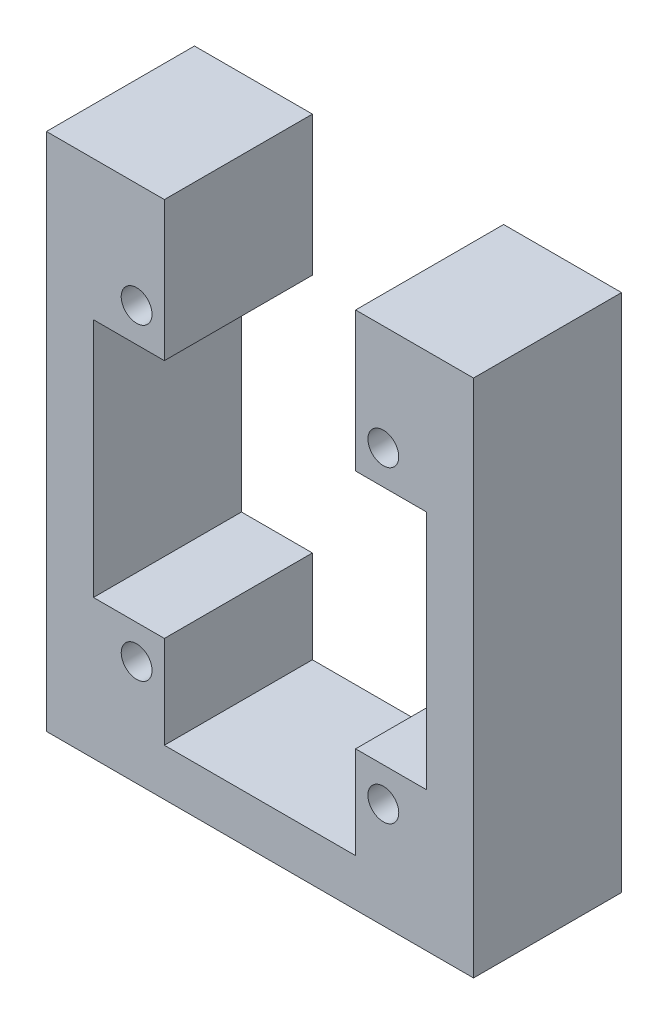
ISO-10303-21;
HEADER;
FILE_DESCRIPTION(('STEP AP214'),'2;1');
FILE_NAME('part.step','',(''),(''),'','','');
FILE_SCHEMA(('AUTOMOTIVE_DESIGN { 1 0 10303 214 1 1 1 1 }'));
ENDSEC;
DATA;
#1=APPLICATION_CONTEXT('core data for automotive mechanical design processes');
#2=APPLICATION_PROTOCOL_DEFINITION('international standard','automotive_design',2000,#1);
#3=PRODUCT_CONTEXT('',#1,'mechanical');
#4=PRODUCT('Part','Part','',(#3));
#5=PRODUCT_RELATED_PRODUCT_CATEGORY('part','',(#4));
#6=PRODUCT_DEFINITION_FORMATION('','',#4);
#7=PRODUCT_DEFINITION_CONTEXT('part definition',#1,'design');
#8=PRODUCT_DEFINITION('design','',#6,#7);
#9=PRODUCT_DEFINITION_SHAPE('','',#8);
#10=(LENGTH_UNIT() NAMED_UNIT(*) SI_UNIT(.MILLI.,.METRE.));
#11=(NAMED_UNIT(*) PLANE_ANGLE_UNIT() SI_UNIT($,.RADIAN.));
#12=(NAMED_UNIT(*) SI_UNIT($,.STERADIAN.) SOLID_ANGLE_UNIT());
#13=UNCERTAINTY_MEASURE_WITH_UNIT(LENGTH_MEASURE(1.E-05),#10,'distance_accuracy_value','');
#14=(GEOMETRIC_REPRESENTATION_CONTEXT(3) GLOBAL_UNCERTAINTY_ASSIGNED_CONTEXT((#13)) GLOBAL_UNIT_ASSIGNED_CONTEXT((#10,
#11,#12)) REPRESENTATION_CONTEXT('',''));
#15=CARTESIAN_POINT('',(0.,0.,0.));
#16=DIRECTION('',(0.,0.,1.));
#17=DIRECTION('',(1.,0.,0.));
#18=AXIS2_PLACEMENT_3D('',#15,#16,#17);
#19=CARTESIAN_POINT('',(-17.31,21.06,12.));
#20=DIRECTION('',(0.,-1.,0.));
#21=DIRECTION('',(0.,0.,-1.));
#22=AXIS2_PLACEMENT_3D('',#19,#20,#21);
#23=PLANE('',#22);
#24=DIRECTION('',(-1.,0.,0.));
#25=VECTOR('',#24,1.);
#26=CARTESIAN_POINT('',(-17.31,21.06,12.));
#27=LINE('',#26,#25);
#28=CARTESIAN_POINT('',(-7.75,21.06,12.));
#29=VERTEX_POINT('',#28);
#30=CARTESIAN_POINT('',(-17.31,21.06,12.));
#31=VERTEX_POINT('',#30);
#32=EDGE_CURVE('E160',#29,#31,#27,.T.);
#33=ORIENTED_EDGE('',*,*,#32,.F.);
#34=DIRECTION('',(0.,0.,-1.));
#35=VECTOR('',#34,1.);
#36=CARTESIAN_POINT('',(-7.75,21.06,12.));
#37=LINE('',#36,#35);
#38=CARTESIAN_POINT('',(-7.75,21.06,0.));
#39=VERTEX_POINT('',#38);
#40=EDGE_CURVE('E167',#29,#39,#37,.T.);
#41=ORIENTED_EDGE('',*,*,#40,.T.);
#42=DIRECTION('',(-1.,0.,0.));
#43=VECTOR('',#42,1.);
#44=CARTESIAN_POINT('',(-17.31,21.06,0.));
#45=LINE('',#44,#43);
#46=CARTESIAN_POINT('',(-17.31,21.06,0.));
#47=VERTEX_POINT('',#46);
#48=EDGE_CURVE('E193',#39,#47,#45,.T.);
#49=ORIENTED_EDGE('',*,*,#48,.T.);
#50=DIRECTION('',(0.,0.,-1.));
#51=VECTOR('',#50,1.);
#52=CARTESIAN_POINT('',(-17.31,21.06,12.));
#53=LINE('',#52,#51);
#54=EDGE_CURVE('E47',#31,#47,#53,.T.);
#55=ORIENTED_EDGE('',*,*,#54,.F.);
#56=EDGE_LOOP('',(#33,#41,#49,#55));
#57=FACE_BOUND('',#56,.T.);
#58=ADVANCED_FACE('F39',(#57),#23,.F.);
#59=CARTESIAN_POINT('',(0.,0.,12.));
#60=DIRECTION('',(0.,0.,-1.));
#61=DIRECTION('',(-1.,0.,0.));
#62=AXIS2_PLACEMENT_3D('',#59,#60,#61);
#63=PLANE('',#62);
#64=DIRECTION('',(0.,-1.,0.));
#65=VECTOR('',#64,1.);
#66=CARTESIAN_POINT('',(-7.75,17.25,12.));
#67=LINE('',#66,#65);
#68=CARTESIAN_POINT('',(-7.75,9.75,12.));
#69=VERTEX_POINT('',#68);
#70=EDGE_CURVE('E155',#29,#69,#67,.T.);
#71=ORIENTED_EDGE('',*,*,#70,.F.);
#72=ORIENTED_EDGE('',*,*,#32,.T.);
#73=DIRECTION('',(0.,-1.,0.));
#74=VECTOR('',#73,1.);
#75=CARTESIAN_POINT('',(-17.31,-21.06,12.));
#76=LINE('',#75,#74);
#77=CARTESIAN_POINT('',(-17.31,-21.06,12.));
#78=VERTEX_POINT('',#77);
#79=EDGE_CURVE('E180',#31,#78,#76,.T.);
#80=ORIENTED_EDGE('',*,*,#79,.T.);
#81=DIRECTION('',(1.,0.,0.));
#82=VECTOR('',#81,1.);
#83=CARTESIAN_POINT('',(-17.31,-21.06,12.));
#84=LINE('',#83,#82);
#85=CARTESIAN_POINT('',(17.31,-21.06,12.));
#86=VERTEX_POINT('',#85);
#87=EDGE_CURVE('E187',#78,#86,#84,.T.);
#88=ORIENTED_EDGE('',*,*,#87,.T.);
#89=DIRECTION('',(0.,1.,0.));
#90=VECTOR('',#89,1.);
#91=CARTESIAN_POINT('',(17.31,-21.06,12.));
#92=LINE('',#91,#90);
#93=CARTESIAN_POINT('',(17.31,21.06,12.));
#94=VERTEX_POINT('',#93);
#95=EDGE_CURVE('E177',#86,#94,#92,.T.);
#96=ORIENTED_EDGE('',*,*,#95,.T.);
#97=CARTESIAN_POINT('',(7.75,21.06,12.));
#98=VERTEX_POINT('',#97);
#99=EDGE_CURVE('E176',#94,#98,#27,.T.);
#100=ORIENTED_EDGE('',*,*,#99,.T.);
#101=DIRECTION('',(0.,1.,0.));
#102=VECTOR('',#101,1.);
#103=CARTESIAN_POINT('',(7.75,17.25,12.));
#104=LINE('',#103,#102);
#105=CARTESIAN_POINT('',(7.75,9.75,12.));
#106=VERTEX_POINT('',#105);
#107=EDGE_CURVE('E222',#106,#98,#104,.T.);
#108=ORIENTED_EDGE('',*,*,#107,.F.);
#109=DIRECTION('',(-1.,0.,0.));
#110=VECTOR('',#109,1.);
#111=CARTESIAN_POINT('',(13.5,9.75,12.));
#112=LINE('',#111,#110);
#113=CARTESIAN_POINT('',(13.5,9.75,12.));
#114=VERTEX_POINT('',#113);
#115=EDGE_CURVE('E297',#114,#106,#112,.T.);
#116=ORIENTED_EDGE('',*,*,#115,.F.);
#117=DIRECTION('',(0.,1.,0.));
#118=VECTOR('',#117,1.);
#119=CARTESIAN_POINT('',(13.5,-17.25,12.));
#120=LINE('',#119,#118);
#121=CARTESIAN_POINT('',(13.5,-9.75,12.));
#122=VERTEX_POINT('',#121);
#123=EDGE_CURVE('E310',#122,#114,#120,.T.);
#124=ORIENTED_EDGE('',*,*,#123,.F.);
#125=DIRECTION('',(1.,0.,0.));
#126=VECTOR('',#125,1.);
#127=CARTESIAN_POINT('',(13.5,-9.75,12.));
#128=LINE('',#127,#126);
#129=CARTESIAN_POINT('',(7.75,-9.75,12.));
#130=VERTEX_POINT('',#129);
#131=EDGE_CURVE('E274',#130,#122,#128,.T.);
#132=ORIENTED_EDGE('',*,*,#131,.F.);
#133=DIRECTION('',(0.,1.,0.));
#134=VECTOR('',#133,1.);
#135=CARTESIAN_POINT('',(7.75,-17.25,12.));
#136=LINE('',#135,#134);
#137=CARTESIAN_POINT('',(7.75,-17.25,12.));
#138=VERTEX_POINT('',#137);
#139=EDGE_CURVE('E280',#138,#130,#136,.T.);
#140=ORIENTED_EDGE('',*,*,#139,.F.);
#141=DIRECTION('',(1.,0.,0.));
#142=VECTOR('',#141,1.);
#143=CARTESIAN_POINT('',(-13.5,-17.25,12.));
#144=LINE('',#143,#142);
#145=CARTESIAN_POINT('',(-7.75,-17.25,12.));
#146=VERTEX_POINT('',#145);
#147=EDGE_CURVE('E194',#146,#138,#144,.T.);
#148=ORIENTED_EDGE('',*,*,#147,.F.);
#149=DIRECTION('',(0.,-1.,0.));
#150=VECTOR('',#149,1.);
#151=CARTESIAN_POINT('',(-7.75,-17.25,12.));
#152=LINE('',#151,#150);
#153=CARTESIAN_POINT('',(-7.75,-9.75,12.));
#154=VERTEX_POINT('',#153);
#155=EDGE_CURVE('E253',#154,#146,#152,.T.);
#156=ORIENTED_EDGE('',*,*,#155,.F.);
#157=DIRECTION('',(1.,0.,0.));
#158=VECTOR('',#157,1.);
#159=CARTESIAN_POINT('',(-13.5,-9.75000000000001,12.));
#160=LINE('',#159,#158);
#161=CARTESIAN_POINT('',(-13.5,-9.75000000000001,12.));
#162=VERTEX_POINT('',#161);
#163=EDGE_CURVE('E261',#162,#154,#160,.T.);
#164=ORIENTED_EDGE('',*,*,#163,.F.);
#165=DIRECTION('',(0.,-1.,0.));
#166=VECTOR('',#165,1.);
#167=CARTESIAN_POINT('',(-13.5,-17.25,12.));
#168=LINE('',#167,#166);
#169=CARTESIAN_POINT('',(-13.5,9.75000000000001,12.));
#170=VERTEX_POINT('',#169);
#171=EDGE_CURVE('E313',#170,#162,#168,.T.);
#172=ORIENTED_EDGE('',*,*,#171,.F.);
#173=DIRECTION('',(-1.,0.,0.));
#174=VECTOR('',#173,1.);
#175=CARTESIAN_POINT('',(-13.5,9.75000000000001,12.));
#176=LINE('',#175,#174);
#177=EDGE_CURVE('E163',#69,#170,#176,.T.);
#178=ORIENTED_EDGE('',*,*,#177,.F.);
#179=EDGE_LOOP('',(#71,#72,#80,#88,#96,#100,#108,#116,#124,#132,#140,#148,#156,#164,#172,#178));
#180=FACE_BOUND('',#179,.T.);
#181=CARTESIAN_POINT('',(-10.,-12.5,12.));
#182=DIRECTION('',(0.,0.,-1.));
#183=DIRECTION('',(-1.,0.,0.));
#184=AXIS2_PLACEMENT_3D('',#181,#182,#183);
#185=CIRCLE('',#184,1.25);
#186=CARTESIAN_POINT('',(-11.25,-12.5,12.));
#187=VERTEX_POINT('',#186);
#188=EDGE_CURVE('E263',#187,#187,#185,.T.);
#189=ORIENTED_EDGE('',*,*,#188,.T.);
#190=EDGE_LOOP('',(#189));
#191=FACE_BOUND('',#190,.T.);
#192=CARTESIAN_POINT('',(10.,-12.5,12.));
#193=DIRECTION('',(0.,0.,-1.));
#194=DIRECTION('',(1.,0.,0.));
#195=AXIS2_PLACEMENT_3D('',#192,#193,#194);
#196=CIRCLE('',#195,1.25);
#197=CARTESIAN_POINT('',(11.25,-12.5,12.));
#198=VERTEX_POINT('',#197);
#199=EDGE_CURVE('E283',#198,#198,#196,.T.);
#200=ORIENTED_EDGE('',*,*,#199,.T.);
#201=EDGE_LOOP('',(#200));
#202=FACE_BOUND('',#201,.T.);
#203=CARTESIAN_POINT('',(-10.,12.5,12.));
#204=DIRECTION('',(0.,0.,-1.));
#205=DIRECTION('',(1.,0.,0.));
#206=AXIS2_PLACEMENT_3D('',#203,#204,#205);
#207=CIRCLE('',#206,1.25);
#208=CARTESIAN_POINT('',(-8.75,12.5,12.));
#209=VERTEX_POINT('',#208);
#210=EDGE_CURVE('E242',#209,#209,#207,.T.);
#211=ORIENTED_EDGE('',*,*,#210,.T.);
#212=EDGE_LOOP('',(#211));
#213=FACE_BOUND('',#212,.T.);
#214=CARTESIAN_POINT('',(10.,12.5,12.));
#215=DIRECTION('',(0.,0.,-1.));
#216=DIRECTION('',(-1.,0.,0.));
#217=AXIS2_PLACEMENT_3D('',#214,#215,#216);
#218=CIRCLE('',#217,1.25);
#219=CARTESIAN_POINT('',(8.75,12.5,12.));
#220=VERTEX_POINT('',#219);
#221=EDGE_CURVE('E291',#220,#220,#218,.T.);
#222=ORIENTED_EDGE('',*,*,#221,.T.);
#223=EDGE_LOOP('',(#222));
#224=FACE_BOUND('',#223,.T.);
#225=ADVANCED_FACE('F157',(#180,#191,#202,#213,#224),#63,.F.);
#226=CARTESIAN_POINT('',(0.,0.,0.));
#227=DIRECTION('',(0.,0.,-1.));
#228=DIRECTION('',(-1.,0.,0.));
#229=AXIS2_PLACEMENT_3D('',#226,#227,#228);
#230=PLANE('',#229);
#231=ORIENTED_EDGE('',*,*,#48,.F.);
#232=DIRECTION('',(0.,-1.,0.));
#233=VECTOR('',#232,1.);
#234=CARTESIAN_POINT('',(-7.75,17.25,0.));
#235=LINE('',#234,#233);
#236=CARTESIAN_POINT('',(-7.75,9.75,0.));
#237=VERTEX_POINT('',#236);
#238=EDGE_CURVE('E169',#39,#237,#235,.T.);
#239=ORIENTED_EDGE('',*,*,#238,.T.);
#240=DIRECTION('',(-1.,0.,0.));
#241=VECTOR('',#240,1.);
#242=CARTESIAN_POINT('',(-13.5,9.75000000000001,0.));
#243=LINE('',#242,#241);
#244=CARTESIAN_POINT('',(-13.5,9.75000000000001,0.));
#245=VERTEX_POINT('',#244);
#246=EDGE_CURVE('E54',#237,#245,#243,.T.);
#247=ORIENTED_EDGE('',*,*,#246,.T.);
#248=DIRECTION('',(0.,-1.,0.));
#249=VECTOR('',#248,1.);
#250=CARTESIAN_POINT('',(-13.5,-17.25,0.));
#251=LINE('',#250,#249);
#252=CARTESIAN_POINT('',(-13.5,-9.75000000000001,0.));
#253=VERTEX_POINT('',#252);
#254=EDGE_CURVE('E321',#245,#253,#251,.T.);
#255=ORIENTED_EDGE('',*,*,#254,.T.);
#256=DIRECTION('',(1.,0.,0.));
#257=VECTOR('',#256,1.);
#258=CARTESIAN_POINT('',(-13.5,-9.75000000000001,0.));
#259=LINE('',#258,#257);
#260=CARTESIAN_POINT('',(-7.75,-9.75,0.));
#261=VERTEX_POINT('',#260);
#262=EDGE_CURVE('E260',#253,#261,#259,.T.);
#263=ORIENTED_EDGE('',*,*,#262,.T.);
#264=DIRECTION('',(0.,-1.,0.));
#265=VECTOR('',#264,1.);
#266=CARTESIAN_POINT('',(-7.75,-17.25,0.));
#267=LINE('',#266,#265);
#268=CARTESIAN_POINT('',(-7.75,-17.25,0.));
#269=VERTEX_POINT('',#268);
#270=EDGE_CURVE('E61',#261,#269,#267,.T.);
#271=ORIENTED_EDGE('',*,*,#270,.T.);
#272=DIRECTION('',(1.,0.,0.));
#273=VECTOR('',#272,1.);
#274=CARTESIAN_POINT('',(-13.5,-17.25,0.));
#275=LINE('',#274,#273);
#276=CARTESIAN_POINT('',(7.75,-17.25,0.));
#277=VERTEX_POINT('',#276);
#278=EDGE_CURVE('E314',#269,#277,#275,.T.);
#279=ORIENTED_EDGE('',*,*,#278,.T.);
#280=DIRECTION('',(0.,1.,0.));
#281=VECTOR('',#280,1.);
#282=CARTESIAN_POINT('',(7.75,-17.25,0.));
#283=LINE('',#282,#281);
#284=CARTESIAN_POINT('',(7.75,-9.75,0.));
#285=VERTEX_POINT('',#284);
#286=EDGE_CURVE('E279',#277,#285,#283,.T.);
#287=ORIENTED_EDGE('',*,*,#286,.T.);
#288=DIRECTION('',(1.,0.,0.));
#289=VECTOR('',#288,1.);
#290=CARTESIAN_POINT('',(13.5,-9.75,0.));
#291=LINE('',#290,#289);
#292=CARTESIAN_POINT('',(13.5,-9.75,0.));
#293=VERTEX_POINT('',#292);
#294=EDGE_CURVE('E276',#285,#293,#291,.T.);
#295=ORIENTED_EDGE('',*,*,#294,.T.);
#296=DIRECTION('',(0.,1.,0.));
#297=VECTOR('',#296,1.);
#298=CARTESIAN_POINT('',(13.5,-17.25,0.));
#299=LINE('',#298,#297);
#300=CARTESIAN_POINT('',(13.5,9.75,0.));
#301=VERTEX_POINT('',#300);
#302=EDGE_CURVE('E307',#293,#301,#299,.T.);
#303=ORIENTED_EDGE('',*,*,#302,.T.);
#304=DIRECTION('',(-1.,0.,0.));
#305=VECTOR('',#304,1.);
#306=CARTESIAN_POINT('',(13.5,9.75,0.));
#307=LINE('',#306,#305);
#308=CARTESIAN_POINT('',(7.75,9.75,0.));
#309=VERTEX_POINT('',#308);
#310=EDGE_CURVE('E294',#301,#309,#307,.T.);
#311=ORIENTED_EDGE('',*,*,#310,.T.);
#312=DIRECTION('',(0.,1.,0.));
#313=VECTOR('',#312,1.);
#314=CARTESIAN_POINT('',(7.75,17.25,0.));
#315=LINE('',#314,#313);
#316=CARTESIAN_POINT('',(7.75,21.06,0.));
#317=VERTEX_POINT('',#316);
#318=EDGE_CURVE('E299',#309,#317,#315,.T.);
#319=ORIENTED_EDGE('',*,*,#318,.T.);
#320=CARTESIAN_POINT('',(17.31,21.06,0.));
#321=VERTEX_POINT('',#320);
#322=EDGE_CURVE('E195',#321,#317,#45,.T.);
#323=ORIENTED_EDGE('',*,*,#322,.F.);
#324=DIRECTION('',(0.,1.,0.));
#325=VECTOR('',#324,1.);
#326=CARTESIAN_POINT('',(17.31,-21.06,0.));
#327=LINE('',#326,#325);
#328=CARTESIAN_POINT('',(17.31,-21.06,0.));
#329=VERTEX_POINT('',#328);
#330=EDGE_CURVE('E190',#329,#321,#327,.T.);
#331=ORIENTED_EDGE('',*,*,#330,.F.);
#332=DIRECTION('',(1.,0.,0.));
#333=VECTOR('',#332,1.);
#334=CARTESIAN_POINT('',(-17.31,-21.06,0.));
#335=LINE('',#334,#333);
#336=CARTESIAN_POINT('',(-17.31,-21.06,0.));
#337=VERTEX_POINT('',#336);
#338=EDGE_CURVE('E182',#337,#329,#335,.T.);
#339=ORIENTED_EDGE('',*,*,#338,.F.);
#340=DIRECTION('',(0.,-1.,0.));
#341=VECTOR('',#340,1.);
#342=CARTESIAN_POINT('',(-17.31,-21.06,0.));
#343=LINE('',#342,#341);
#344=EDGE_CURVE('E198',#47,#337,#343,.T.);
#345=ORIENTED_EDGE('',*,*,#344,.F.);
#346=EDGE_LOOP('',(#231,#239,#247,#255,#263,#271,#279,#287,#295,#303,#311,#319,#323,#331,#339,#345));
#347=FACE_BOUND('',#346,.T.);
#348=CARTESIAN_POINT('',(-10.,-12.5,0.));
#349=DIRECTION('',(0.,0.,-1.));
#350=DIRECTION('',(-1.,0.,0.));
#351=AXIS2_PLACEMENT_3D('',#348,#349,#350);
#352=CIRCLE('',#351,1.25);
#353=CARTESIAN_POINT('',(-11.25,-12.5,0.));
#354=VERTEX_POINT('',#353);
#355=EDGE_CURVE('E239',#354,#354,#352,.T.);
#356=ORIENTED_EDGE('',*,*,#355,.F.);
#357=EDGE_LOOP('',(#356));
#358=FACE_BOUND('',#357,.T.);
#359=CARTESIAN_POINT('',(10.,-12.5,0.));
#360=DIRECTION('',(0.,0.,-1.));
#361=DIRECTION('',(1.,0.,0.));
#362=AXIS2_PLACEMENT_3D('',#359,#360,#361);
#363=CIRCLE('',#362,1.25);
#364=CARTESIAN_POINT('',(11.25,-12.5,0.));
#365=VERTEX_POINT('',#364);
#366=EDGE_CURVE('E258',#365,#365,#363,.T.);
#367=ORIENTED_EDGE('',*,*,#366,.F.);
#368=EDGE_LOOP('',(#367));
#369=FACE_BOUND('',#368,.T.);
#370=CARTESIAN_POINT('',(-10.,12.5,0.));
#371=DIRECTION('',(0.,0.,-1.));
#372=DIRECTION('',(1.,0.,0.));
#373=AXIS2_PLACEMENT_3D('',#370,#371,#372);
#374=CIRCLE('',#373,1.25);
#375=CARTESIAN_POINT('',(-8.75,12.5,0.));
#376=VERTEX_POINT('',#375);
#377=EDGE_CURVE('E244',#376,#376,#374,.T.);
#378=ORIENTED_EDGE('',*,*,#377,.F.);
#379=EDGE_LOOP('',(#378));
#380=FACE_BOUND('',#379,.T.);
#381=CARTESIAN_POINT('',(10.,12.5,0.));
#382=DIRECTION('',(0.,0.,-1.));
#383=DIRECTION('',(-1.,0.,0.));
#384=AXIS2_PLACEMENT_3D('',#381,#382,#383);
#385=CIRCLE('',#384,1.25);
#386=CARTESIAN_POINT('',(8.75,12.5,0.));
#387=VERTEX_POINT('',#386);
#388=EDGE_CURVE('E247',#387,#387,#385,.T.);
#389=ORIENTED_EDGE('',*,*,#388,.F.);
#390=EDGE_LOOP('',(#389));
#391=FACE_BOUND('',#390,.T.);
#392=ADVANCED_FACE('F210',(#347,#358,#369,#380,#391),#230,.T.);
#393=CARTESIAN_POINT('',(17.31,-21.06,12.));
#394=DIRECTION('',(-1.,0.,0.));
#395=DIRECTION('',(0.,0.,1.));
#396=AXIS2_PLACEMENT_3D('',#393,#394,#395);
#397=PLANE('',#396);
#398=ORIENTED_EDGE('',*,*,#330,.T.);
#399=DIRECTION('',(0.,0.,-1.));
#400=VECTOR('',#399,1.);
#401=CARTESIAN_POINT('',(17.31,21.06,12.));
#402=LINE('',#401,#400);
#403=EDGE_CURVE('E11',#94,#321,#402,.T.);
#404=ORIENTED_EDGE('',*,*,#403,.F.);
#405=ORIENTED_EDGE('',*,*,#95,.F.);
#406=DIRECTION('',(0.,0.,-1.));
#407=VECTOR('',#406,1.);
#408=CARTESIAN_POINT('',(17.31,-21.06,12.));
#409=LINE('',#408,#407);
#410=EDGE_CURVE('E189',#86,#329,#409,.T.);
#411=ORIENTED_EDGE('',*,*,#410,.T.);
#412=EDGE_LOOP('',(#398,#404,#405,#411));
#413=FACE_BOUND('',#412,.T.);
#414=ADVANCED_FACE('F41',(#413),#397,.F.);
#415=ORIENTED_EDGE('',*,*,#322,.T.);
#416=DIRECTION('',(0.,0.,-1.));
#417=VECTOR('',#416,1.);
#418=CARTESIAN_POINT('',(7.75,21.06,12.));
#419=LINE('',#418,#417);
#420=EDGE_CURVE('E172',#98,#317,#419,.T.);
#421=ORIENTED_EDGE('',*,*,#420,.F.);
#422=ORIENTED_EDGE('',*,*,#99,.F.);
#423=ORIENTED_EDGE('',*,*,#403,.T.);
#424=EDGE_LOOP('',(#415,#421,#422,#423));
#425=FACE_BOUND('',#424,.T.);
#426=ADVANCED_FACE('F226',(#425),#23,.F.);
#427=CARTESIAN_POINT('',(-17.31,-21.06,12.));
#428=DIRECTION('',(1.,0.,0.));
#429=DIRECTION('',(0.,0.,-1.));
#430=AXIS2_PLACEMENT_3D('',#427,#428,#429);
#431=PLANE('',#430);
#432=ORIENTED_EDGE('',*,*,#344,.T.);
#433=DIRECTION('',(0.,0.,-1.));
#434=VECTOR('',#433,1.);
#435=CARTESIAN_POINT('',(-17.31,-21.06,12.));
#436=LINE('',#435,#434);
#437=EDGE_CURVE('E203',#78,#337,#436,.T.);
#438=ORIENTED_EDGE('',*,*,#437,.F.);
#439=ORIENTED_EDGE('',*,*,#79,.F.);
#440=ORIENTED_EDGE('',*,*,#54,.T.);
#441=EDGE_LOOP('',(#432,#438,#439,#440));
#442=FACE_BOUND('',#441,.T.);
#443=ADVANCED_FACE('F207',(#442),#431,.F.);
#444=CARTESIAN_POINT('',(-17.31,-21.06,12.));
#445=DIRECTION('',(0.,1.,0.));
#446=DIRECTION('',(0.,0.,1.));
#447=AXIS2_PLACEMENT_3D('',#444,#445,#446);
#448=PLANE('',#447);
#449=ORIENTED_EDGE('',*,*,#338,.T.);
#450=ORIENTED_EDGE('',*,*,#410,.F.);
#451=ORIENTED_EDGE('',*,*,#87,.F.);
#452=ORIENTED_EDGE('',*,*,#437,.T.);
#453=EDGE_LOOP('',(#449,#450,#451,#452));
#454=FACE_BOUND('',#453,.T.);
#455=ADVANCED_FACE('F215',(#454),#448,.F.);
#456=CARTESIAN_POINT('',(13.5,-17.25,12.));
#457=DIRECTION('',(-1.,0.,0.));
#458=DIRECTION('',(0.,0.,1.));
#459=AXIS2_PLACEMENT_3D('',#456,#457,#458);
#460=PLANE('',#459);
#461=DIRECTION('',(0.,0.,-1.));
#462=VECTOR('',#461,1.);
#463=CARTESIAN_POINT('',(13.5,-9.75,12.));
#464=LINE('',#463,#462);
#465=EDGE_CURVE('E230',#122,#293,#464,.T.);
#466=ORIENTED_EDGE('',*,*,#465,.F.);
#467=ORIENTED_EDGE('',*,*,#123,.T.);
#468=DIRECTION('',(0.,0.,-1.));
#469=VECTOR('',#468,1.);
#470=CARTESIAN_POINT('',(13.5,9.75,12.));
#471=LINE('',#470,#469);
#472=EDGE_CURVE('E301',#114,#301,#471,.T.);
#473=ORIENTED_EDGE('',*,*,#472,.T.);
#474=ORIENTED_EDGE('',*,*,#302,.F.);
#475=EDGE_LOOP('',(#466,#467,#473,#474));
#476=FACE_BOUND('',#475,.T.);
#477=ADVANCED_FACE('F339',(#476),#460,.T.);
#478=CARTESIAN_POINT('',(-13.5,-17.25,12.));
#479=DIRECTION('',(1.,0.,0.));
#480=DIRECTION('',(0.,0.,-1.));
#481=AXIS2_PLACEMENT_3D('',#478,#479,#480);
#482=PLANE('',#481);
#483=DIRECTION('',(0.,0.,-1.));
#484=VECTOR('',#483,1.);
#485=CARTESIAN_POINT('',(-13.5,-9.75000000000001,12.));
#486=LINE('',#485,#484);
#487=EDGE_CURVE('E250',#162,#253,#486,.T.);
#488=ORIENTED_EDGE('',*,*,#487,.T.);
#489=ORIENTED_EDGE('',*,*,#254,.F.);
#490=DIRECTION('',(0.,0.,-1.));
#491=VECTOR('',#490,1.);
#492=CARTESIAN_POINT('',(-13.5,9.75000000000001,12.));
#493=LINE('',#492,#491);
#494=EDGE_CURVE('E237',#170,#245,#493,.T.);
#495=ORIENTED_EDGE('',*,*,#494,.F.);
#496=ORIENTED_EDGE('',*,*,#171,.T.);
#497=EDGE_LOOP('',(#488,#489,#495,#496));
#498=FACE_BOUND('',#497,.T.);
#499=ADVANCED_FACE('F380',(#498),#482,.T.);
#500=CARTESIAN_POINT('',(-13.5,-17.25,12.));
#501=DIRECTION('',(0.,1.,0.));
#502=DIRECTION('',(0.,0.,1.));
#503=AXIS2_PLACEMENT_3D('',#500,#501,#502);
#504=PLANE('',#503);
#505=DIRECTION('',(0.,0.,-1.));
#506=VECTOR('',#505,1.);
#507=CARTESIAN_POINT('',(7.75,-17.25,12.));
#508=LINE('',#507,#506);
#509=EDGE_CURVE('E271',#138,#277,#508,.T.);
#510=ORIENTED_EDGE('',*,*,#509,.T.);
#511=ORIENTED_EDGE('',*,*,#278,.F.);
#512=DIRECTION('',(0.,0.,-1.));
#513=VECTOR('',#512,1.);
#514=CARTESIAN_POINT('',(-7.75,-17.25,12.));
#515=LINE('',#514,#513);
#516=EDGE_CURVE('E256',#146,#269,#515,.T.);
#517=ORIENTED_EDGE('',*,*,#516,.F.);
#518=ORIENTED_EDGE('',*,*,#147,.T.);
#519=EDGE_LOOP('',(#510,#511,#517,#518));
#520=FACE_BOUND('',#519,.T.);
#521=ADVANCED_FACE('F326',(#520),#504,.T.);
#522=CARTESIAN_POINT('',(-7.75,-17.25,12.));
#523=DIRECTION('',(1.,0.,0.));
#524=DIRECTION('',(0.,1.,0.));
#525=AXIS2_PLACEMENT_3D('',#522,#523,#524);
#526=PLANE('',#525);
#527=ORIENTED_EDGE('',*,*,#270,.F.);
#528=DIRECTION('',(0.,0.,-1.));
#529=VECTOR('',#528,1.);
#530=CARTESIAN_POINT('',(-7.75,-9.75,12.));
#531=LINE('',#530,#529);
#532=EDGE_CURVE('E254',#154,#261,#531,.T.);
#533=ORIENTED_EDGE('',*,*,#532,.F.);
#534=ORIENTED_EDGE('',*,*,#155,.T.);
#535=ORIENTED_EDGE('',*,*,#516,.T.);
#536=EDGE_LOOP('',(#527,#533,#534,#535));
#537=FACE_BOUND('',#536,.T.);
#538=ADVANCED_FACE('F388',(#537),#526,.T.);
#539=CARTESIAN_POINT('',(-13.5,-9.75000000000001,12.));
#540=DIRECTION('',(0.,1.,0.));
#541=DIRECTION('',(-1.,0.,0.));
#542=AXIS2_PLACEMENT_3D('',#539,#540,#541);
#543=PLANE('',#542);
#544=ORIENTED_EDGE('',*,*,#262,.F.);
#545=ORIENTED_EDGE('',*,*,#487,.F.);
#546=ORIENTED_EDGE('',*,*,#163,.T.);
#547=ORIENTED_EDGE('',*,*,#532,.T.);
#548=EDGE_LOOP('',(#544,#545,#546,#547));
#549=FACE_BOUND('',#548,.T.);
#550=ADVANCED_FACE('F392',(#549),#543,.T.);
#551=CARTESIAN_POINT('',(-10.,-12.5,12.));
#552=DIRECTION('',(0.,0.,-1.));
#553=DIRECTION('',(-1.,0.,0.));
#554=AXIS2_PLACEMENT_3D('',#551,#552,#553);
#555=CYLINDRICAL_SURFACE('',#554,1.25);
#556=ORIENTED_EDGE('',*,*,#188,.F.);
#557=EDGE_LOOP('',(#556));
#558=FACE_BOUND('',#557,.T.);
#559=ORIENTED_EDGE('',*,*,#355,.T.);
#560=EDGE_LOOP('',(#559));
#561=FACE_BOUND('',#560,.T.);
#562=ADVANCED_FACE('F398',(#558,#561),#555,.F.);
#563=CARTESIAN_POINT('',(13.5,-9.75,12.));
#564=DIRECTION('',(0.,1.,0.));
#565=DIRECTION('',(0.,0.,1.));
#566=AXIS2_PLACEMENT_3D('',#563,#564,#565);
#567=PLANE('',#566);
#568=ORIENTED_EDGE('',*,*,#294,.F.);
#569=DIRECTION('',(0.,0.,-1.));
#570=VECTOR('',#569,1.);
#571=CARTESIAN_POINT('',(7.75,-9.75,12.));
#572=LINE('',#571,#570);
#573=EDGE_CURVE('E232',#130,#285,#572,.T.);
#574=ORIENTED_EDGE('',*,*,#573,.F.);
#575=ORIENTED_EDGE('',*,*,#131,.T.);
#576=ORIENTED_EDGE('',*,*,#465,.T.);
#577=EDGE_LOOP('',(#568,#574,#575,#576));
#578=FACE_BOUND('',#577,.T.);
#579=ADVANCED_FACE('F336',(#578),#567,.T.);
#580=CARTESIAN_POINT('',(7.75,-17.25,12.));
#581=DIRECTION('',(-1.,0.,0.));
#582=DIRECTION('',(0.,-1.,0.));
#583=AXIS2_PLACEMENT_3D('',#580,#581,#582);
#584=PLANE('',#583);
#585=ORIENTED_EDGE('',*,*,#286,.F.);
#586=ORIENTED_EDGE('',*,*,#509,.F.);
#587=ORIENTED_EDGE('',*,*,#139,.T.);
#588=ORIENTED_EDGE('',*,*,#573,.T.);
#589=EDGE_LOOP('',(#585,#586,#587,#588));
#590=FACE_BOUND('',#589,.T.);
#591=ADVANCED_FACE('F330',(#590),#584,.T.);
#592=CARTESIAN_POINT('',(10.,-12.5,12.));
#593=DIRECTION('',(0.,0.,-1.));
#594=DIRECTION('',(-1.,0.,0.));
#595=AXIS2_PLACEMENT_3D('',#592,#593,#594);
#596=CYLINDRICAL_SURFACE('',#595,1.25);
#597=ORIENTED_EDGE('',*,*,#199,.F.);
#598=EDGE_LOOP('',(#597));
#599=FACE_BOUND('',#598,.T.);
#600=ORIENTED_EDGE('',*,*,#366,.T.);
#601=EDGE_LOOP('',(#600));
#602=FACE_BOUND('',#601,.T.);
#603=ADVANCED_FACE('F407',(#599,#602),#596,.F.);
#604=CARTESIAN_POINT('',(-13.5,9.75000000000001,12.));
#605=DIRECTION('',(0.,-1.,0.));
#606=DIRECTION('',(1.,0.,0.));
#607=AXIS2_PLACEMENT_3D('',#604,#605,#606);
#608=PLANE('',#607);
#609=ORIENTED_EDGE('',*,*,#246,.F.);
#610=DIRECTION('',(0.,0.,-1.));
#611=VECTOR('',#610,1.);
#612=CARTESIAN_POINT('',(-7.75,9.75,12.));
#613=LINE('',#612,#611);
#614=EDGE_CURVE('E235',#69,#237,#613,.T.);
#615=ORIENTED_EDGE('',*,*,#614,.F.);
#616=ORIENTED_EDGE('',*,*,#177,.T.);
#617=ORIENTED_EDGE('',*,*,#494,.T.);
#618=EDGE_LOOP('',(#609,#615,#616,#617));
#619=FACE_BOUND('',#618,.T.);
#620=ADVANCED_FACE('F411',(#619),#608,.T.);
#621=CARTESIAN_POINT('',(-7.75,17.25,12.));
#622=DIRECTION('',(1.,0.,0.));
#623=DIRECTION('',(0.,1.,0.));
#624=AXIS2_PLACEMENT_3D('',#621,#622,#623);
#625=PLANE('',#624);
#626=ORIENTED_EDGE('',*,*,#238,.F.);
#627=ORIENTED_EDGE('',*,*,#40,.F.);
#628=ORIENTED_EDGE('',*,*,#70,.T.);
#629=ORIENTED_EDGE('',*,*,#614,.T.);
#630=EDGE_LOOP('',(#626,#627,#628,#629));
#631=FACE_BOUND('',#630,.T.);
#632=ADVANCED_FACE('F168',(#631),#625,.T.);
#633=CARTESIAN_POINT('',(-10.,12.5,12.));
#634=DIRECTION('',(0.,0.,-1.));
#635=DIRECTION('',(-1.,0.,0.));
#636=AXIS2_PLACEMENT_3D('',#633,#634,#635);
#637=CYLINDRICAL_SURFACE('',#636,1.25);
#638=ORIENTED_EDGE('',*,*,#210,.F.);
#639=EDGE_LOOP('',(#638));
#640=FACE_BOUND('',#639,.T.);
#641=ORIENTED_EDGE('',*,*,#377,.T.);
#642=EDGE_LOOP('',(#641));
#643=FACE_BOUND('',#642,.T.);
#644=ADVANCED_FACE('F344',(#640,#643),#637,.F.);
#645=CARTESIAN_POINT('',(7.75,17.25,12.));
#646=DIRECTION('',(-1.,0.,0.));
#647=DIRECTION('',(0.,-1.,0.));
#648=AXIS2_PLACEMENT_3D('',#645,#646,#647);
#649=PLANE('',#648);
#650=ORIENTED_EDGE('',*,*,#318,.F.);
#651=DIRECTION('',(0.,0.,-1.));
#652=VECTOR('',#651,1.);
#653=CARTESIAN_POINT('',(7.75,9.75,12.));
#654=LINE('',#653,#652);
#655=EDGE_CURVE('E305',#106,#309,#654,.T.);
#656=ORIENTED_EDGE('',*,*,#655,.F.);
#657=ORIENTED_EDGE('',*,*,#107,.T.);
#658=ORIENTED_EDGE('',*,*,#420,.T.);
#659=EDGE_LOOP('',(#650,#656,#657,#658));
#660=FACE_BOUND('',#659,.T.);
#661=ADVANCED_FACE('F342',(#660),#649,.T.);
#662=CARTESIAN_POINT('',(13.5,9.75,12.));
#663=DIRECTION('',(0.,-1.,0.));
#664=DIRECTION('',(0.,0.,-1.));
#665=AXIS2_PLACEMENT_3D('',#662,#663,#664);
#666=PLANE('',#665);
#667=ORIENTED_EDGE('',*,*,#310,.F.);
#668=ORIENTED_EDGE('',*,*,#472,.F.);
#669=ORIENTED_EDGE('',*,*,#115,.T.);
#670=ORIENTED_EDGE('',*,*,#655,.T.);
#671=EDGE_LOOP('',(#667,#668,#669,#670));
#672=FACE_BOUND('',#671,.T.);
#673=ADVANCED_FACE('F341',(#672),#666,.T.);
#674=CARTESIAN_POINT('',(10.,12.5,12.));
#675=DIRECTION('',(0.,0.,-1.));
#676=DIRECTION('',(-1.,0.,0.));
#677=AXIS2_PLACEMENT_3D('',#674,#675,#676);
#678=CYLINDRICAL_SURFACE('',#677,1.25);
#679=ORIENTED_EDGE('',*,*,#221,.F.);
#680=EDGE_LOOP('',(#679));
#681=FACE_BOUND('',#680,.T.);
#682=ORIENTED_EDGE('',*,*,#388,.T.);
#683=EDGE_LOOP('',(#682));
#684=FACE_BOUND('',#683,.T.);
#685=ADVANCED_FACE('F350',(#681,#684),#678,.F.);
#686=CLOSED_SHELL('',(#58,#225,#392,#414,#426,#443,#455,#477,#499,#521,#538,#550,#562,#579,#591,
#603,#620,#632,#644,#661,#673,#685));
#687=MANIFOLD_SOLID_BREP('B2',#686);
#688=ADVANCED_BREP_SHAPE_REPRESENTATION('',(#18,#687),#14);
#689=SHAPE_DEFINITION_REPRESENTATION(#9,#688);
ENDSEC;
END-ISO-10303-21;
